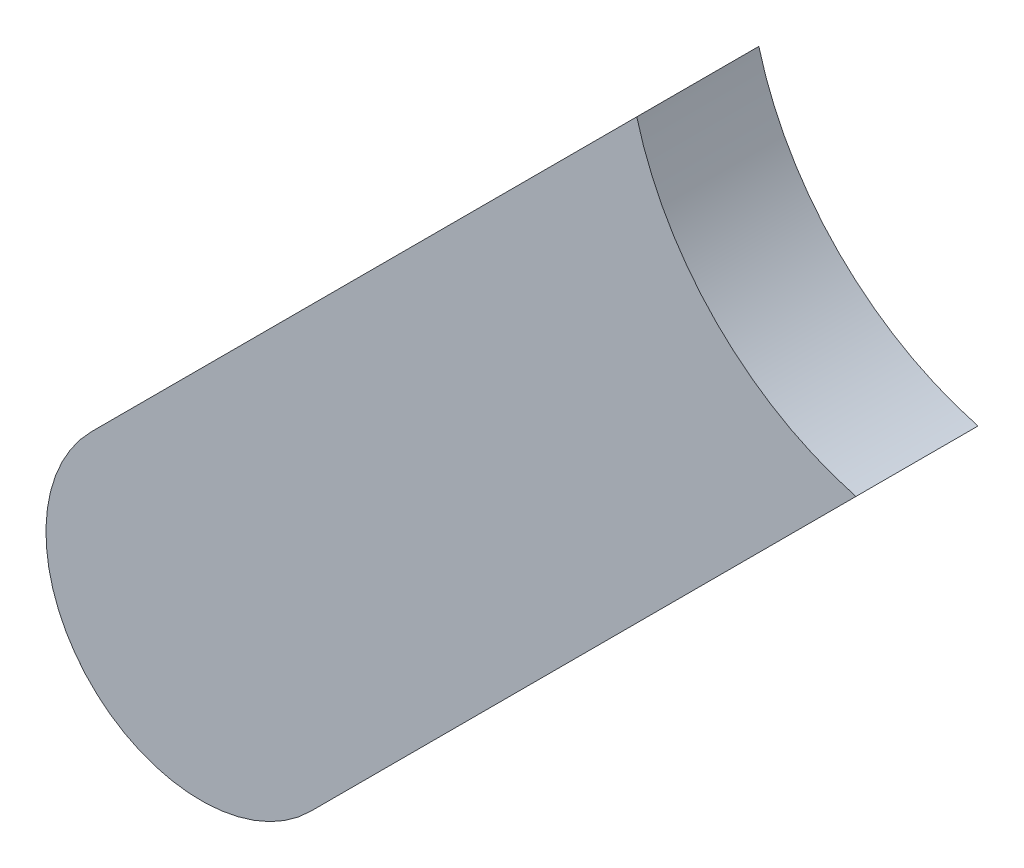
ISO-10303-21;
HEADER;
FILE_DESCRIPTION(('STEP AP214'),'2;1');
FILE_NAME('part.step','',(''),(''),'','','');
FILE_SCHEMA(('AUTOMOTIVE_DESIGN { 1 0 10303 214 1 1 1 1 }'));
ENDSEC;
DATA;
#1=APPLICATION_CONTEXT('core data for automotive mechanical design processes');
#2=APPLICATION_PROTOCOL_DEFINITION('international standard','automotive_design',2000,#1);
#3=PRODUCT_CONTEXT('',#1,'mechanical');
#4=PRODUCT('Part','Part','',(#3));
#5=PRODUCT_RELATED_PRODUCT_CATEGORY('part','',(#4));
#6=PRODUCT_DEFINITION_FORMATION('','',#4);
#7=PRODUCT_DEFINITION_CONTEXT('part definition',#1,'design');
#8=PRODUCT_DEFINITION('design','',#6,#7);
#9=PRODUCT_DEFINITION_SHAPE('','',#8);
#10=(LENGTH_UNIT() NAMED_UNIT(*) SI_UNIT(.MILLI.,.METRE.));
#11=(NAMED_UNIT(*) PLANE_ANGLE_UNIT() SI_UNIT($,.RADIAN.));
#12=(NAMED_UNIT(*) SI_UNIT($,.STERADIAN.) SOLID_ANGLE_UNIT());
#13=UNCERTAINTY_MEASURE_WITH_UNIT(LENGTH_MEASURE(1.E-05),#10,'distance_accuracy_value','');
#14=(GEOMETRIC_REPRESENTATION_CONTEXT(3) GLOBAL_UNCERTAINTY_ASSIGNED_CONTEXT((#13)) GLOBAL_UNIT_ASSIGNED_CONTEXT((#10,
#11,#12)) REPRESENTATION_CONTEXT('',''));
#15=CARTESIAN_POINT('',(0.,0.,0.));
#16=DIRECTION('',(0.,0.,1.));
#17=DIRECTION('',(1.,0.,0.));
#18=AXIS2_PLACEMENT_3D('',#15,#16,#17);
#19=CARTESIAN_POINT('',(151.75562994,108.9784206,0.));
#20=DIRECTION('',(-0.707106781186535,0.70710678118656,0.));
#21=DIRECTION('',(0.70710678118656,0.707106781186535,0.));
#22=AXIS2_PLACEMENT_3D('',#19,#20,#21);
#23=PLANE('',#22);
#24=DIRECTION('',(0.70710678118656,0.707106781186535,0.));
#25=VECTOR('',#24,1.);
#26=CARTESIAN_POINT('',(151.75562994,108.9784206,0.1999996));
#27=LINE('',#26,#25);
#28=CARTESIAN_POINT('',(151.75562994,108.9784206,0.1999996));
#29=VERTEX_POINT('',#28);
#30=CARTESIAN_POINT('',(152.649519211461,109.872309871461,0.1999996));
#31=VERTEX_POINT('',#30);
#32=EDGE_CURVE('E11',#29,#31,#27,.T.);
#33=ORIENTED_EDGE('',*,*,#32,.F.);
#34=DIRECTION('',(0.,0.,1.));
#35=VECTOR('',#34,1.);
#36=CARTESIAN_POINT('',(151.75562994,108.9784206,0.));
#37=LINE('',#36,#35);
#38=CARTESIAN_POINT('',(151.75562994,108.9784206,0.));
#39=VERTEX_POINT('',#38);
#40=EDGE_CURVE('E24',#39,#29,#37,.T.);
#41=ORIENTED_EDGE('',*,*,#40,.F.);
#42=DIRECTION('',(0.70710678118656,0.707106781186535,0.));
#43=VECTOR('',#42,1.);
#44=CARTESIAN_POINT('',(151.75562994,108.9784206,0.));
#45=LINE('',#44,#43);
#46=CARTESIAN_POINT('',(152.649519211461,109.872309871461,0.));
#47=VERTEX_POINT('',#46);
#48=EDGE_CURVE('E75',#39,#47,#45,.T.);
#49=ORIENTED_EDGE('',*,*,#48,.T.);
#50=DIRECTION('',(0.,0.,1.));
#51=VECTOR('',#50,1.);
#52=CARTESIAN_POINT('',(152.649519211461,109.872309871461,0.));
#53=LINE('',#52,#51);
#54=EDGE_CURVE('E37',#47,#31,#53,.T.);
#55=ORIENTED_EDGE('',*,*,#54,.T.);
#56=EDGE_LOOP('',(#33,#41,#49,#55));
#57=FACE_BOUND('',#56,.T.);
#58=ADVANCED_FACE('F17',(#57),#23,.F.);
#59=CARTESIAN_POINT('',(152.781,110.363,0.));
#60=DIRECTION('',(0.,0.,-1.));
#61=DIRECTION('',(1.,0.,0.));
#62=AXIS2_PLACEMENT_3D('',#59,#60,#61);
#63=CYLINDRICAL_SURFACE('',#62,0.508);
#64=DIRECTION('',(0.,0.,1.));
#65=VECTOR('',#64,1.);
#66=CARTESIAN_POINT('',(152.290309871461,110.231519211461,0.));
#67=LINE('',#66,#65);
#68=CARTESIAN_POINT('',(152.290309871461,110.231519211461,0.));
#69=VERTEX_POINT('',#68);
#70=CARTESIAN_POINT('',(152.290309871461,110.231519211461,0.1999996));
#71=VERTEX_POINT('',#70);
#72=EDGE_CURVE('E67',#69,#71,#67,.T.);
#73=ORIENTED_EDGE('',*,*,#72,.T.);
#74=CARTESIAN_POINT('',(152.781,110.363,0.1999996));
#75=DIRECTION('',(0.,0.,1.));
#76=DIRECTION('',(1.,0.,0.));
#77=AXIS2_PLACEMENT_3D('',#74,#75,#76);
#78=CIRCLE('',#77,0.508);
#79=EDGE_CURVE('E82',#71,#31,#78,.T.);
#80=ORIENTED_EDGE('',*,*,#79,.T.);
#81=ORIENTED_EDGE('',*,*,#54,.F.);
#82=CARTESIAN_POINT('',(152.781,110.363,0.));
#83=DIRECTION('',(0.,0.,1.));
#84=DIRECTION('',(1.,0.,0.));
#85=AXIS2_PLACEMENT_3D('',#82,#83,#84);
#86=CIRCLE('',#85,0.508);
#87=EDGE_CURVE('E80',#69,#47,#86,.T.);
#88=ORIENTED_EDGE('',*,*,#87,.F.);
#89=EDGE_LOOP('',(#73,#80,#81,#88));
#90=FACE_BOUND('',#89,.T.);
#91=ADVANCED_FACE('F88',(#90),#63,.F.);
#92=CARTESIAN_POINT('',(152.290309871461,110.231519211461,0.));
#93=DIRECTION('',(0.707106781186556,-0.707106781186539,0.));
#94=DIRECTION('',(-0.707106781186539,-0.707106781186556,0.));
#95=AXIS2_PLACEMENT_3D('',#92,#93,#94);
#96=PLANE('',#95);
#97=DIRECTION('',(-0.707106781186539,-0.707106781186556,0.));
#98=VECTOR('',#97,1.);
#99=CARTESIAN_POINT('',(152.60139406,110.5426034,0.1999996));
#100=LINE('',#99,#98);
#101=CARTESIAN_POINT('',(151.3964206,109.33762994,0.1999996));
#102=VERTEX_POINT('',#101);
#103=EDGE_CURVE('E71',#71,#102,#100,.T.);
#104=ORIENTED_EDGE('',*,*,#103,.F.);
#105=ORIENTED_EDGE('',*,*,#72,.F.);
#106=DIRECTION('',(-0.707106781186539,-0.707106781186556,0.));
#107=VECTOR('',#106,1.);
#108=CARTESIAN_POINT('',(152.60139406,110.5426034,0.));
#109=LINE('',#108,#107);
#110=CARTESIAN_POINT('',(151.3964206,109.33762994,0.));
#111=VERTEX_POINT('',#110);
#112=EDGE_CURVE('E63',#69,#111,#109,.T.);
#113=ORIENTED_EDGE('',*,*,#112,.T.);
#114=DIRECTION('',(0.,0.,1.));
#115=VECTOR('',#114,1.);
#116=CARTESIAN_POINT('',(151.3964206,109.33762994,0.));
#117=LINE('',#116,#115);
#118=EDGE_CURVE('E53',#111,#102,#117,.T.);
#119=ORIENTED_EDGE('',*,*,#118,.T.);
#120=EDGE_LOOP('',(#104,#105,#113,#119));
#121=FACE_BOUND('',#120,.T.);
#122=ADVANCED_FACE('F66',(#121),#96,.F.);
#123=CARTESIAN_POINT('',(151.57602527,109.15802527,0.));
#124=DIRECTION('',(0.,0.,-1.));
#125=DIRECTION('',(-0.707106781186576,0.70710678118652,0.));
#126=AXIS2_PLACEMENT_3D('',#123,#124,#125);
#127=CYLINDRICAL_SURFACE('',#126,0.253999360179532);
#128=CARTESIAN_POINT('',(151.57602527,109.15802527,0.1999996));
#129=DIRECTION('',(0.,0.,1.));
#130=DIRECTION('',(-0.707106781186576,0.70710678118652,0.));
#131=AXIS2_PLACEMENT_3D('',#128,#129,#130);
#132=CIRCLE('',#131,0.253999360179532);
#133=EDGE_CURVE('E59',#102,#29,#132,.T.);
#134=ORIENTED_EDGE('',*,*,#133,.F.);
#135=ORIENTED_EDGE('',*,*,#118,.F.);
#136=CARTESIAN_POINT('',(151.57602527,109.15802527,0.));
#137=DIRECTION('',(0.,0.,1.));
#138=DIRECTION('',(-0.707106781186576,0.70710678118652,0.));
#139=AXIS2_PLACEMENT_3D('',#136,#137,#138);
#140=CIRCLE('',#139,0.253999360179532);
#141=EDGE_CURVE('E57',#111,#39,#140,.T.);
#142=ORIENTED_EDGE('',*,*,#141,.T.);
#143=ORIENTED_EDGE('',*,*,#40,.T.);
#144=EDGE_LOOP('',(#134,#135,#142,#143));
#145=FACE_BOUND('',#144,.T.);
#146=ADVANCED_FACE('F55',(#145),#127,.T.);
#147=CARTESIAN_POINT('',(151.75562994,108.9784206,0.));
#148=DIRECTION('',(0.,0.,-1.));
#149=DIRECTION('',(-1.,0.,0.));
#150=AXIS2_PLACEMENT_3D('',#147,#148,#149);
#151=PLANE('',#150);
#152=ORIENTED_EDGE('',*,*,#48,.F.);
#153=ORIENTED_EDGE('',*,*,#141,.F.);
#154=ORIENTED_EDGE('',*,*,#112,.F.);
#155=ORIENTED_EDGE('',*,*,#87,.T.);
#156=EDGE_LOOP('',(#152,#153,#154,#155));
#157=FACE_BOUND('',#156,.T.);
#158=ADVANCED_FACE('F74',(#157),#151,.T.);
#159=CARTESIAN_POINT('',(151.75562994,108.9784206,0.1999996));
#160=DIRECTION('',(0.,0.,-1.));
#161=DIRECTION('',(-1.,0.,0.));
#162=AXIS2_PLACEMENT_3D('',#159,#160,#161);
#163=PLANE('',#162);
#164=ORIENTED_EDGE('',*,*,#133,.T.);
#165=ORIENTED_EDGE('',*,*,#32,.T.);
#166=ORIENTED_EDGE('',*,*,#79,.F.);
#167=ORIENTED_EDGE('',*,*,#103,.T.);
#168=EDGE_LOOP('',(#164,#165,#166,#167));
#169=FACE_BOUND('',#168,.T.);
#170=ADVANCED_FACE('F91',(#169),#163,.F.);
#171=CLOSED_SHELL('',(#58,#91,#122,#146,#158,#170));
#172=MANIFOLD_SOLID_BREP('B1',#171);
#173=ADVANCED_BREP_SHAPE_REPRESENTATION('',(#18,#172),#14);
#174=SHAPE_DEFINITION_REPRESENTATION(#9,#173);
ENDSEC;
END-ISO-10303-21;
